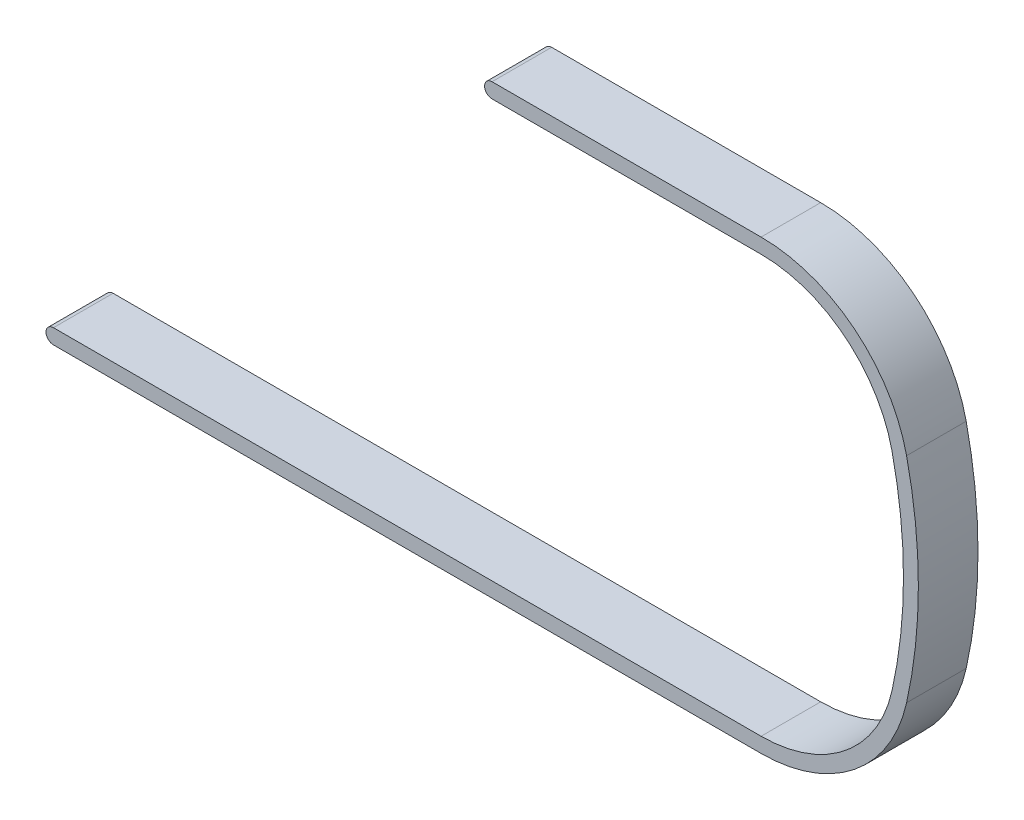
ISO-10303-21;
HEADER;
FILE_DESCRIPTION(('STEP AP214'),'2;1');
FILE_NAME('part.step','',(''),(''),'','','');
FILE_SCHEMA(('AUTOMOTIVE_DESIGN { 1 0 10303 214 1 1 1 1 }'));
ENDSEC;
DATA;
#1=APPLICATION_CONTEXT('core data for automotive mechanical design processes');
#2=APPLICATION_PROTOCOL_DEFINITION('international standard','automotive_design',2000,#1);
#3=PRODUCT_CONTEXT('',#1,'mechanical');
#4=PRODUCT('Part','Part','',(#3));
#5=PRODUCT_RELATED_PRODUCT_CATEGORY('part','',(#4));
#6=PRODUCT_DEFINITION_FORMATION('','',#4);
#7=PRODUCT_DEFINITION_CONTEXT('part definition',#1,'design');
#8=PRODUCT_DEFINITION('design','',#6,#7);
#9=PRODUCT_DEFINITION_SHAPE('','',#8);
#10=(LENGTH_UNIT() NAMED_UNIT(*) SI_UNIT(.MILLI.,.METRE.));
#11=(NAMED_UNIT(*) PLANE_ANGLE_UNIT() SI_UNIT($,.RADIAN.));
#12=(NAMED_UNIT(*) SI_UNIT($,.STERADIAN.) SOLID_ANGLE_UNIT());
#13=UNCERTAINTY_MEASURE_WITH_UNIT(LENGTH_MEASURE(1.E-05),#10,'distance_accuracy_value','');
#14=(GEOMETRIC_REPRESENTATION_CONTEXT(3) GLOBAL_UNCERTAINTY_ASSIGNED_CONTEXT((#13)) GLOBAL_UNIT_ASSIGNED_CONTEXT((#10,
#11,#12)) REPRESENTATION_CONTEXT('',''));
#15=CARTESIAN_POINT('',(0.,0.,0.));
#16=DIRECTION('',(0.,0.,1.));
#17=DIRECTION('',(1.,0.,0.));
#18=AXIS2_PLACEMENT_3D('',#15,#16,#17);
#19=CARTESIAN_POINT('',(174.679242577546,-150.,40.));
#20=DIRECTION('',(0.,0.,-1.));
#21=DIRECTION('',(-1.,0.,0.));
#22=AXIS2_PLACEMENT_3D('',#19,#20,#21);
#23=CYLINDRICAL_SURFACE('',#22,100.);
#24=CARTESIAN_POINT('',(174.679242577546,-150.,0.));
#25=DIRECTION('',(0.,0.,1.));
#26=DIRECTION('',(1.,0.,0.));
#27=AXIS2_PLACEMENT_3D('',#24,#25,#26);
#28=CIRCLE('',#27,100.);
#29=CARTESIAN_POINT('',(174.679242577546,-250.,0.));
#30=VERTEX_POINT('',#29);
#31=CARTESIAN_POINT('',(272.277838453407,-171.783344166136,0.));
#32=VERTEX_POINT('',#31);
#33=EDGE_CURVE('E169',#30,#32,#28,.T.);
#34=ORIENTED_EDGE('',*,*,#33,.T.);
#35=DIRECTION('',(0.,0.,-1.));
#36=VECTOR('',#35,1.);
#37=CARTESIAN_POINT('',(272.277838453407,-171.783344166136,40.));
#38=LINE('',#37,#36);
#39=CARTESIAN_POINT('',(272.277838453407,-171.783344166136,40.));
#40=VERTEX_POINT('',#39);
#41=EDGE_CURVE('E11',#40,#32,#38,.T.);
#42=ORIENTED_EDGE('',*,*,#41,.F.);
#43=CARTESIAN_POINT('',(174.679242577546,-150.,40.));
#44=DIRECTION('',(0.,0.,1.));
#45=DIRECTION('',(1.,0.,0.));
#46=AXIS2_PLACEMENT_3D('',#43,#44,#45);
#47=CIRCLE('',#46,100.);
#48=CARTESIAN_POINT('',(174.679242577546,-250.,40.));
#49=VERTEX_POINT('',#48);
#50=EDGE_CURVE('E191',#49,#40,#47,.T.);
#51=ORIENTED_EDGE('',*,*,#50,.F.);
#52=DIRECTION('',(0.,0.,-1.));
#53=VECTOR('',#52,1.);
#54=CARTESIAN_POINT('',(174.679242577546,-250.,40.));
#55=LINE('',#54,#53);
#56=EDGE_CURVE('E165',#49,#30,#55,.T.);
#57=ORIENTED_EDGE('',*,*,#56,.T.);
#58=EDGE_LOOP('',(#34,#42,#51,#57));
#59=FACE_BOUND('',#58,.T.);
#60=ADVANCED_FACE('F49',(#59),#23,.T.);
#61=CARTESIAN_POINT('',(-49.3419066351344,-99.9999999999999,40.));
#62=DIRECTION('',(0.,0.,-1.));
#63=DIRECTION('',(-1.,0.,0.));
#64=AXIS2_PLACEMENT_3D('',#61,#62,#63);
#65=CYLINDRICAL_SURFACE('',#64,329.533168179612);
#66=CARTESIAN_POINT('',(-49.3419066351344,-99.9999999999999,0.));
#67=DIRECTION('',(0.,0.,1.));
#68=DIRECTION('',(-1.,0.,0.));
#69=AXIS2_PLACEMENT_3D('',#66,#67,#68);
#70=CIRCLE('',#69,329.533168179612);
#71=CARTESIAN_POINT('',(272.277838453407,-28.2166558338642,0.));
#72=VERTEX_POINT('',#71);
#73=EDGE_CURVE('E172',#32,#72,#70,.T.);
#74=ORIENTED_EDGE('',*,*,#73,.T.);
#75=DIRECTION('',(0.,0.,-1.));
#76=VECTOR('',#75,1.);
#77=CARTESIAN_POINT('',(272.277838453407,-28.2166558338642,40.));
#78=LINE('',#77,#76);
#79=CARTESIAN_POINT('',(272.277838453407,-28.2166558338642,40.));
#80=VERTEX_POINT('',#79);
#81=EDGE_CURVE('E57',#80,#72,#78,.T.);
#82=ORIENTED_EDGE('',*,*,#81,.F.);
#83=CARTESIAN_POINT('',(-49.3419066351344,-99.9999999999999,40.));
#84=DIRECTION('',(0.,0.,1.));
#85=DIRECTION('',(-1.,0.,0.));
#86=AXIS2_PLACEMENT_3D('',#83,#84,#85);
#87=CIRCLE('',#86,329.533168179612);
#88=EDGE_CURVE('E120',#40,#80,#87,.T.);
#89=ORIENTED_EDGE('',*,*,#88,.F.);
#90=ORIENTED_EDGE('',*,*,#41,.T.);
#91=EDGE_LOOP('',(#74,#82,#89,#90));
#92=FACE_BOUND('',#91,.T.);
#93=ADVANCED_FACE('F269',(#92),#65,.T.);
#94=CARTESIAN_POINT('',(174.679242577546,-50.,40.));
#95=DIRECTION('',(0.,0.,-1.));
#96=DIRECTION('',(-1.,0.,0.));
#97=AXIS2_PLACEMENT_3D('',#94,#95,#96);
#98=CYLINDRICAL_SURFACE('',#97,100.);
#99=CARTESIAN_POINT('',(174.679242577546,-50.,0.));
#100=DIRECTION('',(0.,0.,1.));
#101=DIRECTION('',(-1.,0.,0.));
#102=AXIS2_PLACEMENT_3D('',#99,#100,#101);
#103=CIRCLE('',#102,100.);
#104=CARTESIAN_POINT('',(174.679242577546,50.,0.));
#105=VERTEX_POINT('',#104);
#106=EDGE_CURVE('E174',#72,#105,#103,.T.);
#107=ORIENTED_EDGE('',*,*,#106,.T.);
#108=DIRECTION('',(0.,0.,-1.));
#109=VECTOR('',#108,1.);
#110=CARTESIAN_POINT('',(174.679242577546,50.,40.));
#111=LINE('',#110,#109);
#112=CARTESIAN_POINT('',(174.679242577546,50.,40.));
#113=VERTEX_POINT('',#112);
#114=EDGE_CURVE('E210',#113,#105,#111,.T.);
#115=ORIENTED_EDGE('',*,*,#114,.F.);
#116=CARTESIAN_POINT('',(174.679242577546,-50.,40.));
#117=DIRECTION('',(0.,0.,1.));
#118=DIRECTION('',(-1.,0.,0.));
#119=AXIS2_PLACEMENT_3D('',#116,#117,#118);
#120=CIRCLE('',#119,100.);
#121=EDGE_CURVE('E218',#80,#113,#120,.T.);
#122=ORIENTED_EDGE('',*,*,#121,.F.);
#123=ORIENTED_EDGE('',*,*,#81,.T.);
#124=EDGE_LOOP('',(#107,#115,#122,#123));
#125=FACE_BOUND('',#124,.T.);
#126=ADVANCED_FACE('F216',(#125),#98,.T.);
#127=CARTESIAN_POINT('',(-5.80227228183699,50.,40.));
#128=DIRECTION('',(0.,-1.,0.));
#129=DIRECTION('',(0.,0.,-1.));
#130=AXIS2_PLACEMENT_3D('',#127,#128,#129);
#131=PLANE('',#130);
#132=DIRECTION('',(-1.,0.,0.));
#133=VECTOR('',#132,1.);
#134=CARTESIAN_POINT('',(-5.80227228183699,50.,0.));
#135=LINE('',#134,#133);
#136=CARTESIAN_POINT('',(-5.80227228183699,50.,0.));
#137=VERTEX_POINT('',#136);
#138=EDGE_CURVE('E176',#105,#137,#135,.T.);
#139=ORIENTED_EDGE('',*,*,#138,.T.);
#140=DIRECTION('',(0.,0.,-1.));
#141=VECTOR('',#140,1.);
#142=CARTESIAN_POINT('',(-5.80227228183699,50.,40.));
#143=LINE('',#142,#141);
#144=CARTESIAN_POINT('',(-5.80227228183699,50.,40.));
#145=VERTEX_POINT('',#144);
#146=EDGE_CURVE('E207',#145,#137,#143,.T.);
#147=ORIENTED_EDGE('',*,*,#146,.F.);
#148=DIRECTION('',(-1.,0.,0.));
#149=VECTOR('',#148,1.);
#150=CARTESIAN_POINT('',(-5.80227228183699,50.,40.));
#151=LINE('',#150,#149);
#152=EDGE_CURVE('E236',#113,#145,#151,.T.);
#153=ORIENTED_EDGE('',*,*,#152,.F.);
#154=ORIENTED_EDGE('',*,*,#114,.T.);
#155=EDGE_LOOP('',(#139,#147,#153,#154));
#156=FACE_BOUND('',#155,.T.);
#157=ADVANCED_FACE('F227',(#156),#131,.F.);
#158=CARTESIAN_POINT('',(-5.80227228183699,45.,40.));
#159=DIRECTION('',(0.,0.,-1.));
#160=DIRECTION('',(-1.,0.,0.));
#161=AXIS2_PLACEMENT_3D('',#158,#159,#160);
#162=CYLINDRICAL_SURFACE('',#161,5.);
#163=CARTESIAN_POINT('',(-5.80227228183699,45.,0.));
#164=DIRECTION('',(0.,0.,1.));
#165=DIRECTION('',(1.,0.,0.));
#166=AXIS2_PLACEMENT_3D('',#163,#164,#165);
#167=CIRCLE('',#166,5.);
#168=CARTESIAN_POINT('',(-5.80227228183699,40.,0.));
#169=VERTEX_POINT('',#168);
#170=EDGE_CURVE('E178',#137,#169,#167,.T.);
#171=ORIENTED_EDGE('',*,*,#170,.T.);
#172=DIRECTION('',(0.,0.,-1.));
#173=VECTOR('',#172,1.);
#174=CARTESIAN_POINT('',(-5.80227228183699,40.,40.));
#175=LINE('',#174,#173);
#176=CARTESIAN_POINT('',(-5.80227228183699,40.,40.));
#177=VERTEX_POINT('',#176);
#178=EDGE_CURVE('E204',#177,#169,#175,.T.);
#179=ORIENTED_EDGE('',*,*,#178,.F.);
#180=CARTESIAN_POINT('',(-5.80227228183699,45.,40.));
#181=DIRECTION('',(0.,0.,1.));
#182=DIRECTION('',(1.,0.,0.));
#183=AXIS2_PLACEMENT_3D('',#180,#181,#182);
#184=CIRCLE('',#183,5.);
#185=EDGE_CURVE('E233',#145,#177,#184,.T.);
#186=ORIENTED_EDGE('',*,*,#185,.F.);
#187=ORIENTED_EDGE('',*,*,#146,.T.);
#188=EDGE_LOOP('',(#171,#179,#186,#187));
#189=FACE_BOUND('',#188,.T.);
#190=ADVANCED_FACE('F231',(#189),#162,.T.);
#191=CARTESIAN_POINT('',(-5.80227228183699,40.,40.));
#192=DIRECTION('',(0.,1.,0.));
#193=DIRECTION('',(0.,0.,1.));
#194=AXIS2_PLACEMENT_3D('',#191,#192,#193);
#195=PLANE('',#194);
#196=DIRECTION('',(1.,0.,0.));
#197=VECTOR('',#196,1.);
#198=CARTESIAN_POINT('',(-5.80227228183699,40.,0.));
#199=LINE('',#198,#197);
#200=CARTESIAN_POINT('',(174.679242577546,40.,0.));
#201=VERTEX_POINT('',#200);
#202=EDGE_CURVE('E180',#169,#201,#199,.T.);
#203=ORIENTED_EDGE('',*,*,#202,.T.);
#204=DIRECTION('',(0.,0.,-1.));
#205=VECTOR('',#204,1.);
#206=CARTESIAN_POINT('',(174.679242577546,40.,40.));
#207=LINE('',#206,#205);
#208=CARTESIAN_POINT('',(174.679242577546,40.,40.));
#209=VERTEX_POINT('',#208);
#210=EDGE_CURVE('E201',#209,#201,#207,.T.);
#211=ORIENTED_EDGE('',*,*,#210,.F.);
#212=DIRECTION('',(1.,0.,0.));
#213=VECTOR('',#212,1.);
#214=CARTESIAN_POINT('',(-5.80227228183699,40.,40.));
#215=LINE('',#214,#213);
#216=EDGE_CURVE('E235',#177,#209,#215,.T.);
#217=ORIENTED_EDGE('',*,*,#216,.F.);
#218=ORIENTED_EDGE('',*,*,#178,.T.);
#219=EDGE_LOOP('',(#203,#211,#217,#218));
#220=FACE_BOUND('',#219,.T.);
#221=ADVANCED_FACE('F282',(#220),#195,.F.);
#222=CARTESIAN_POINT('',(174.679242577546,-50.,40.));
#223=DIRECTION('',(0.,0.,-1.));
#224=DIRECTION('',(-1.,0.,0.));
#225=AXIS2_PLACEMENT_3D('',#222,#223,#224);
#226=CYLINDRICAL_SURFACE('',#225,90.);
#227=CARTESIAN_POINT('',(174.679242577546,-50.,0.));
#228=DIRECTION('',(0.,0.,-1.));
#229=DIRECTION('',(-1.,0.,0.));
#230=AXIS2_PLACEMENT_3D('',#227,#228,#229);
#231=CIRCLE('',#230,90.);
#232=CARTESIAN_POINT('',(262.517978865821,-30.3949902504778,0.));
#233=VERTEX_POINT('',#232);
#234=EDGE_CURVE('E182',#201,#233,#231,.T.);
#235=ORIENTED_EDGE('',*,*,#234,.T.);
#236=DIRECTION('',(0.,0.,-1.));
#237=VECTOR('',#236,1.);
#238=CARTESIAN_POINT('',(262.517978865821,-30.3949902504778,40.));
#239=LINE('',#238,#237);
#240=CARTESIAN_POINT('',(262.517978865821,-30.3949902504778,40.));
#241=VERTEX_POINT('',#240);
#242=EDGE_CURVE('E198',#241,#233,#239,.T.);
#243=ORIENTED_EDGE('',*,*,#242,.F.);
#244=CARTESIAN_POINT('',(174.679242577546,-50.,40.));
#245=DIRECTION('',(0.,0.,-1.));
#246=DIRECTION('',(-1.,0.,0.));
#247=AXIS2_PLACEMENT_3D('',#244,#245,#246);
#248=CIRCLE('',#247,90.);
#249=EDGE_CURVE('E238',#209,#241,#248,.T.);
#250=ORIENTED_EDGE('',*,*,#249,.F.);
#251=ORIENTED_EDGE('',*,*,#210,.T.);
#252=EDGE_LOOP('',(#235,#243,#250,#251));
#253=FACE_BOUND('',#252,.T.);
#254=ADVANCED_FACE('F285',(#253),#226,.F.);
#255=CARTESIAN_POINT('',(-49.3419066351344,-99.9999999999999,40.));
#256=DIRECTION('',(0.,0.,-1.));
#257=DIRECTION('',(-1.,0.,0.));
#258=AXIS2_PLACEMENT_3D('',#255,#256,#257);
#259=CYLINDRICAL_SURFACE('',#258,319.533168179612);
#260=CARTESIAN_POINT('',(-49.3419066351344,-99.9999999999999,0.));
#261=DIRECTION('',(0.,0.,-1.));
#262=DIRECTION('',(-1.,0.,0.));
#263=AXIS2_PLACEMENT_3D('',#260,#261,#262);
#264=CIRCLE('',#263,319.533168179612);
#265=CARTESIAN_POINT('',(262.517978865821,-169.605009749522,0.));
#266=VERTEX_POINT('',#265);
#267=EDGE_CURVE('E184',#233,#266,#264,.T.);
#268=ORIENTED_EDGE('',*,*,#267,.T.);
#269=DIRECTION('',(0.,0.,-1.));
#270=VECTOR('',#269,1.);
#271=CARTESIAN_POINT('',(262.517978865821,-169.605009749522,40.));
#272=LINE('',#271,#270);
#273=CARTESIAN_POINT('',(262.517978865821,-169.605009749522,40.));
#274=VERTEX_POINT('',#273);
#275=EDGE_CURVE('E195',#274,#266,#272,.T.);
#276=ORIENTED_EDGE('',*,*,#275,.F.);
#277=CARTESIAN_POINT('',(-49.3419066351344,-99.9999999999999,40.));
#278=DIRECTION('',(0.,0.,-1.));
#279=DIRECTION('',(-1.,0.,0.));
#280=AXIS2_PLACEMENT_3D('',#277,#278,#279);
#281=CIRCLE('',#280,319.533168179612);
#282=EDGE_CURVE('E244',#241,#274,#281,.T.);
#283=ORIENTED_EDGE('',*,*,#282,.F.);
#284=ORIENTED_EDGE('',*,*,#242,.T.);
#285=EDGE_LOOP('',(#268,#276,#283,#284));
#286=FACE_BOUND('',#285,.T.);
#287=ADVANCED_FACE('F250',(#286),#259,.F.);
#288=CARTESIAN_POINT('',(174.679242577546,-150.,40.));
#289=DIRECTION('',(0.,0.,-1.));
#290=DIRECTION('',(-1.,0.,0.));
#291=AXIS2_PLACEMENT_3D('',#288,#289,#290);
#292=CYLINDRICAL_SURFACE('',#291,90.);
#293=CARTESIAN_POINT('',(174.679242577546,-150.,0.));
#294=DIRECTION('',(0.,0.,-1.));
#295=DIRECTION('',(1.,0.,0.));
#296=AXIS2_PLACEMENT_3D('',#293,#294,#295);
#297=CIRCLE('',#296,90.);
#298=CARTESIAN_POINT('',(174.679242577546,-240.,0.));
#299=VERTEX_POINT('',#298);
#300=EDGE_CURVE('E186',#266,#299,#297,.T.);
#301=ORIENTED_EDGE('',*,*,#300,.T.);
#302=DIRECTION('',(0.,0.,-1.));
#303=VECTOR('',#302,1.);
#304=CARTESIAN_POINT('',(174.679242577546,-240.,40.));
#305=LINE('',#304,#303);
#306=CARTESIAN_POINT('',(174.679242577546,-240.,40.));
#307=VERTEX_POINT('',#306);
#308=EDGE_CURVE('E160',#307,#299,#305,.T.);
#309=ORIENTED_EDGE('',*,*,#308,.F.);
#310=CARTESIAN_POINT('',(174.679242577546,-150.,40.));
#311=DIRECTION('',(0.,0.,-1.));
#312=DIRECTION('',(1.,0.,0.));
#313=AXIS2_PLACEMENT_3D('',#310,#311,#312);
#314=CIRCLE('',#313,90.);
#315=EDGE_CURVE('E151',#274,#307,#314,.T.);
#316=ORIENTED_EDGE('',*,*,#315,.F.);
#317=ORIENTED_EDGE('',*,*,#275,.T.);
#318=EDGE_LOOP('',(#301,#309,#316,#317));
#319=FACE_BOUND('',#318,.T.);
#320=ADVANCED_FACE('F254',(#319),#292,.F.);
#321=CARTESIAN_POINT('',(-300.,-240.,40.));
#322=DIRECTION('',(0.,-1.,0.));
#323=DIRECTION('',(0.,0.,-1.));
#324=AXIS2_PLACEMENT_3D('',#321,#322,#323);
#325=PLANE('',#324);
#326=DIRECTION('',(-1.,0.,0.));
#327=VECTOR('',#326,1.);
#328=CARTESIAN_POINT('',(-300.,-240.,0.));
#329=LINE('',#328,#327);
#330=CARTESIAN_POINT('',(-300.,-240.,0.));
#331=VERTEX_POINT('',#330);
#332=EDGE_CURVE('E159',#299,#331,#329,.T.);
#333=ORIENTED_EDGE('',*,*,#332,.T.);
#334=DIRECTION('',(0.,0.,-1.));
#335=VECTOR('',#334,1.);
#336=CARTESIAN_POINT('',(-300.,-240.,40.));
#337=LINE('',#336,#335);
#338=CARTESIAN_POINT('',(-300.,-240.,40.));
#339=VERTEX_POINT('',#338);
#340=EDGE_CURVE('E156',#339,#331,#337,.T.);
#341=ORIENTED_EDGE('',*,*,#340,.F.);
#342=DIRECTION('',(-1.,0.,0.));
#343=VECTOR('',#342,1.);
#344=CARTESIAN_POINT('',(-300.,-240.,40.));
#345=LINE('',#344,#343);
#346=EDGE_CURVE('E145',#307,#339,#345,.T.);
#347=ORIENTED_EDGE('',*,*,#346,.F.);
#348=ORIENTED_EDGE('',*,*,#308,.T.);
#349=EDGE_LOOP('',(#333,#341,#347,#348));
#350=FACE_BOUND('',#349,.T.);
#351=ADVANCED_FACE('F157',(#350),#325,.F.);
#352=CARTESIAN_POINT('',(-300.,-245.,40.));
#353=DIRECTION('',(0.,0.,-1.));
#354=DIRECTION('',(-1.,0.,0.));
#355=AXIS2_PLACEMENT_3D('',#352,#353,#354);
#356=CYLINDRICAL_SURFACE('',#355,5.);
#357=CARTESIAN_POINT('',(-300.,-245.,0.));
#358=DIRECTION('',(0.,0.,1.));
#359=DIRECTION('',(-1.,0.,0.));
#360=AXIS2_PLACEMENT_3D('',#357,#358,#359);
#361=CIRCLE('',#360,5.);
#362=CARTESIAN_POINT('',(-300.,-250.,0.));
#363=VERTEX_POINT('',#362);
#364=EDGE_CURVE('E106',#331,#363,#361,.T.);
#365=ORIENTED_EDGE('',*,*,#364,.T.);
#366=DIRECTION('',(0.,0.,-1.));
#367=VECTOR('',#366,1.);
#368=CARTESIAN_POINT('',(-300.,-250.,40.));
#369=LINE('',#368,#367);
#370=CARTESIAN_POINT('',(-300.,-250.,40.));
#371=VERTEX_POINT('',#370);
#372=EDGE_CURVE('E161',#371,#363,#369,.T.);
#373=ORIENTED_EDGE('',*,*,#372,.F.);
#374=CARTESIAN_POINT('',(-300.,-245.,40.));
#375=DIRECTION('',(0.,0.,1.));
#376=DIRECTION('',(-1.,0.,0.));
#377=AXIS2_PLACEMENT_3D('',#374,#375,#376);
#378=CIRCLE('',#377,5.);
#379=EDGE_CURVE('E149',#339,#371,#378,.T.);
#380=ORIENTED_EDGE('',*,*,#379,.F.);
#381=ORIENTED_EDGE('',*,*,#340,.T.);
#382=EDGE_LOOP('',(#365,#373,#380,#381));
#383=FACE_BOUND('',#382,.T.);
#384=ADVANCED_FACE('F163',(#383),#356,.T.);
#385=CARTESIAN_POINT('',(-300.,-250.,40.));
#386=DIRECTION('',(0.,1.,0.));
#387=DIRECTION('',(0.,0.,1.));
#388=AXIS2_PLACEMENT_3D('',#385,#386,#387);
#389=PLANE('',#388);
#390=DIRECTION('',(1.,0.,0.));
#391=VECTOR('',#390,1.);
#392=CARTESIAN_POINT('',(-300.,-250.,0.));
#393=LINE('',#392,#391);
#394=EDGE_CURVE('E112',#363,#30,#393,.T.);
#395=ORIENTED_EDGE('',*,*,#394,.T.);
#396=ORIENTED_EDGE('',*,*,#56,.F.);
#397=DIRECTION('',(1.,0.,0.));
#398=VECTOR('',#397,1.);
#399=CARTESIAN_POINT('',(-300.,-250.,40.));
#400=LINE('',#399,#398);
#401=EDGE_CURVE('E65',#371,#49,#400,.T.);
#402=ORIENTED_EDGE('',*,*,#401,.F.);
#403=ORIENTED_EDGE('',*,*,#372,.T.);
#404=EDGE_LOOP('',(#395,#396,#402,#403));
#405=FACE_BOUND('',#404,.T.);
#406=ADVANCED_FACE('F258',(#405),#389,.F.);
#407=CARTESIAN_POINT('',(174.679242577546,-150.,40.));
#408=DIRECTION('',(0.,0.,1.));
#409=DIRECTION('',(1.,0.,0.));
#410=AXIS2_PLACEMENT_3D('',#407,#408,#409);
#411=PLANE('',#410);
#412=ORIENTED_EDGE('',*,*,#50,.T.);
#413=ORIENTED_EDGE('',*,*,#88,.T.);
#414=ORIENTED_EDGE('',*,*,#121,.T.);
#415=ORIENTED_EDGE('',*,*,#152,.T.);
#416=ORIENTED_EDGE('',*,*,#185,.T.);
#417=ORIENTED_EDGE('',*,*,#216,.T.);
#418=ORIENTED_EDGE('',*,*,#249,.T.);
#419=ORIENTED_EDGE('',*,*,#282,.T.);
#420=ORIENTED_EDGE('',*,*,#315,.T.);
#421=ORIENTED_EDGE('',*,*,#346,.T.);
#422=ORIENTED_EDGE('',*,*,#379,.T.);
#423=ORIENTED_EDGE('',*,*,#401,.T.);
#424=EDGE_LOOP('',(#412,#413,#414,#415,#416,#417,#418,#419,#420,#421,#422,#423));
#425=FACE_BOUND('',#424,.T.);
#426=ADVANCED_FACE('F147',(#425),#411,.T.);
#427=CARTESIAN_POINT('',(174.679242577546,-150.,0.));
#428=DIRECTION('',(0.,0.,1.));
#429=DIRECTION('',(1.,0.,0.));
#430=AXIS2_PLACEMENT_3D('',#427,#428,#429);
#431=PLANE('',#430);
#432=ORIENTED_EDGE('',*,*,#33,.F.);
#433=ORIENTED_EDGE('',*,*,#394,.F.);
#434=ORIENTED_EDGE('',*,*,#364,.F.);
#435=ORIENTED_EDGE('',*,*,#332,.F.);
#436=ORIENTED_EDGE('',*,*,#300,.F.);
#437=ORIENTED_EDGE('',*,*,#267,.F.);
#438=ORIENTED_EDGE('',*,*,#234,.F.);
#439=ORIENTED_EDGE('',*,*,#202,.F.);
#440=ORIENTED_EDGE('',*,*,#170,.F.);
#441=ORIENTED_EDGE('',*,*,#138,.F.);
#442=ORIENTED_EDGE('',*,*,#106,.F.);
#443=ORIENTED_EDGE('',*,*,#73,.F.);
#444=EDGE_LOOP('',(#432,#433,#434,#435,#436,#437,#438,#439,#440,#441,#442,#443));
#445=FACE_BOUND('',#444,.T.);
#446=ADVANCED_FACE('F222',(#445),#431,.F.);
#447=CLOSED_SHELL('',(#60,#93,#126,#157,#190,#221,#254,#287,#320,#351,#384,#406,#426,#446));
#448=MANIFOLD_SOLID_BREP('B2',#447);
#449=ADVANCED_BREP_SHAPE_REPRESENTATION('',(#18,#448),#14);
#450=SHAPE_DEFINITION_REPRESENTATION(#9,#449);
ENDSEC;
END-ISO-10303-21;
